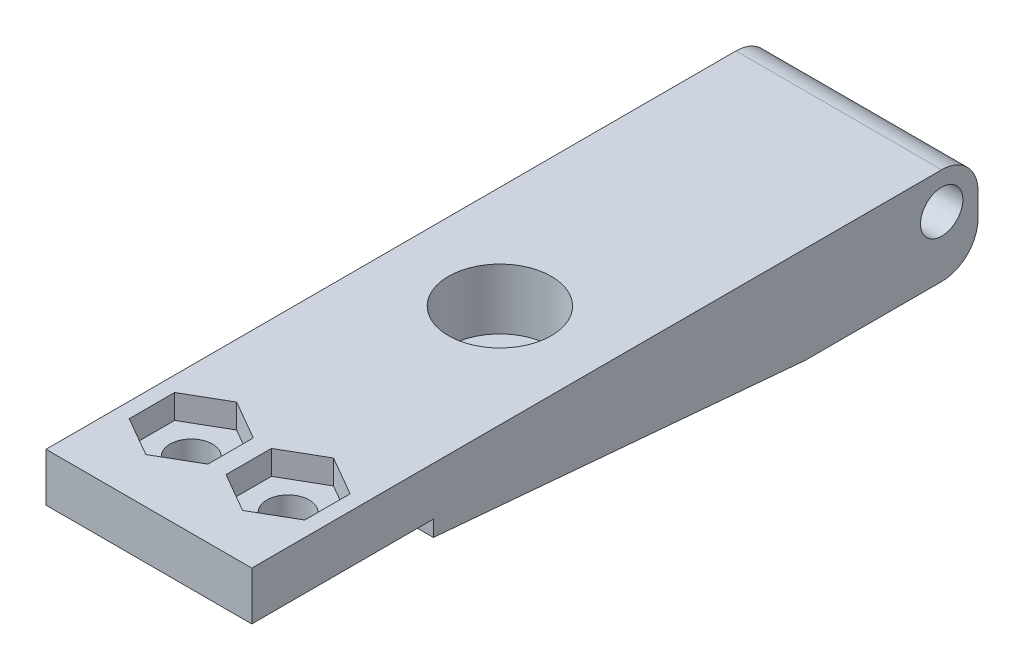
ISO-10303-21;
HEADER;
FILE_DESCRIPTION(('STEP AP214'),'2;1');
FILE_NAME('part.step','',(''),(''),'','','');
FILE_SCHEMA(('AUTOMOTIVE_DESIGN { 1 0 10303 214 1 1 1 1 }'));
ENDSEC;
DATA;
#1=APPLICATION_CONTEXT('core data for automotive mechanical design processes');
#2=APPLICATION_PROTOCOL_DEFINITION('international standard','automotive_design',2000,#1);
#3=PRODUCT_CONTEXT('',#1,'mechanical');
#4=PRODUCT('Part','Part','',(#3));
#5=PRODUCT_RELATED_PRODUCT_CATEGORY('part','',(#4));
#6=PRODUCT_DEFINITION_FORMATION('','',#4);
#7=PRODUCT_DEFINITION_CONTEXT('part definition',#1,'design');
#8=PRODUCT_DEFINITION('design','',#6,#7);
#9=PRODUCT_DEFINITION_SHAPE('','',#8);
#10=(LENGTH_UNIT() NAMED_UNIT(*) SI_UNIT(.MILLI.,.METRE.));
#11=(NAMED_UNIT(*) PLANE_ANGLE_UNIT() SI_UNIT($,.RADIAN.));
#12=(NAMED_UNIT(*) SI_UNIT($,.STERADIAN.) SOLID_ANGLE_UNIT());
#13=UNCERTAINTY_MEASURE_WITH_UNIT(LENGTH_MEASURE(1.E-05),#10,'distance_accuracy_value','');
#14=(GEOMETRIC_REPRESENTATION_CONTEXT(3) GLOBAL_UNCERTAINTY_ASSIGNED_CONTEXT((#13)) GLOBAL_UNIT_ASSIGNED_CONTEXT((#10,
#11,#12)) REPRESENTATION_CONTEXT('',''));
#15=CARTESIAN_POINT('',(0.,0.,0.));
#16=DIRECTION('',(0.,0.,1.));
#17=DIRECTION('',(1.,0.,0.));
#18=AXIS2_PLACEMENT_3D('',#15,#16,#17);
#19=CARTESIAN_POINT('',(4.,-5.,49.5));
#20=DIRECTION('',(0.,1.,0.));
#21=DIRECTION('',(0.,0.,-1.));
#22=AXIS2_PLACEMENT_3D('',#19,#20,#21);
#23=CYLINDRICAL_SURFACE('',#22,1.75);
#24=CARTESIAN_POINT('',(4.,-1.,49.5));
#25=DIRECTION('',(0.,1.,0.));
#26=DIRECTION('',(0.,0.,1.));
#27=AXIS2_PLACEMENT_3D('',#24,#25,#26);
#28=CIRCLE('',#27,1.75);
#29=CARTESIAN_POINT('',(4.,-1.,51.25));
#30=VERTEX_POINT('',#29);
#31=EDGE_CURVE('E239',#30,#30,#28,.T.);
#32=ORIENTED_EDGE('',*,*,#31,.F.);
#33=EDGE_LOOP('',(#32));
#34=FACE_BOUND('',#33,.T.);
#35=CARTESIAN_POINT('',(4.,1.,49.5));
#36=DIRECTION('',(0.,-1.,0.));
#37=DIRECTION('',(0.,0.,-1.));
#38=AXIS2_PLACEMENT_3D('',#35,#36,#37);
#39=CIRCLE('',#38,1.75);
#40=CARTESIAN_POINT('',(4.,1.,47.75));
#41=VERTEX_POINT('',#40);
#42=EDGE_CURVE('E210',#41,#41,#39,.T.);
#43=ORIENTED_EDGE('',*,*,#42,.F.);
#44=EDGE_LOOP('',(#43));
#45=FACE_BOUND('',#44,.T.);
#46=ADVANCED_FACE('F43',(#34,#45),#23,.F.);
#47=CARTESIAN_POINT('',(-4.,-5.,49.5));
#48=DIRECTION('',(0.,1.,0.));
#49=DIRECTION('',(0.,0.,-1.));
#50=AXIS2_PLACEMENT_3D('',#47,#48,#49);
#51=CYLINDRICAL_SURFACE('',#50,1.75);
#52=CARTESIAN_POINT('',(-4.,-1.,49.5));
#53=DIRECTION('',(0.,1.,0.));
#54=DIRECTION('',(0.,0.,1.));
#55=AXIS2_PLACEMENT_3D('',#52,#53,#54);
#56=CIRCLE('',#55,1.75);
#57=CARTESIAN_POINT('',(-4.,-1.,51.25));
#58=VERTEX_POINT('',#57);
#59=EDGE_CURVE('E47',#58,#58,#56,.T.);
#60=ORIENTED_EDGE('',*,*,#59,.F.);
#61=EDGE_LOOP('',(#60));
#62=FACE_BOUND('',#61,.T.);
#63=CARTESIAN_POINT('',(-4.,1.,49.5));
#64=DIRECTION('',(0.,-1.,0.));
#65=DIRECTION('',(0.,0.,-1.));
#66=AXIS2_PLACEMENT_3D('',#63,#64,#65);
#67=CIRCLE('',#66,1.75);
#68=CARTESIAN_POINT('',(-4.,1.,47.75));
#69=VERTEX_POINT('',#68);
#70=EDGE_CURVE('E247',#69,#69,#67,.T.);
#71=ORIENTED_EDGE('',*,*,#70,.F.);
#72=EDGE_LOOP('',(#71));
#73=FACE_BOUND('',#72,.T.);
#74=ADVANCED_FACE('F374',(#62,#73),#51,.F.);
#75=CARTESIAN_POINT('',(8.5,3.,0.));
#76=DIRECTION('',(0.,1.,0.));
#77=DIRECTION('',(0.,0.,-1.));
#78=AXIS2_PLACEMENT_3D('',#75,#76,#77);
#79=PLANE('',#78);
#80=CARTESIAN_POINT('',(0.,3.,28.));
#81=DIRECTION('',(0.,-1.,0.));
#82=DIRECTION('',(0.,0.,-1.));
#83=AXIS2_PLACEMENT_3D('',#80,#81,#82);
#84=CIRCLE('',#83,4.25);
#85=CARTESIAN_POINT('',(0.,3.,23.75));
#86=VERTEX_POINT('',#85);
#87=EDGE_CURVE('E615',#86,#86,#84,.T.);
#88=ORIENTED_EDGE('',*,*,#87,.T.);
#89=EDGE_LOOP('',(#88));
#90=FACE_BOUND('',#89,.T.);
#91=DIRECTION('',(-0.86602540378444,0.,-0.499999999999998));
#92=VECTOR('',#91,1.);
#93=CARTESIAN_POINT('',(-22.0591287436648,3.,38.2075317547307));
#94=LINE('',#93,#92);
#95=CARTESIAN_POINT('',(4.,3.,53.2527767497326));
#96=VERTEX_POINT('',#95);
#97=CARTESIAN_POINT('',(0.749999999999982,3.,51.3763883748663));
#98=VERTEX_POINT('',#97);
#99=EDGE_CURVE('E223',#96,#98,#94,.T.);
#100=ORIENTED_EDGE('',*,*,#99,.T.);
#101=DIRECTION('',(0.,0.,-1.));
#102=VECTOR('',#101,1.);
#103=CARTESIAN_POINT('',(0.749999999999973,3.,0.));
#104=LINE('',#103,#102);
#105=CARTESIAN_POINT('',(0.74999999999998,3.,47.6236116251337));
#106=VERTEX_POINT('',#105);
#107=EDGE_CURVE('E203',#98,#106,#104,.T.);
#108=ORIENTED_EDGE('',*,*,#107,.T.);
#109=DIRECTION('',(0.866025403784438,0.,-0.500000000000001));
#110=VECTOR('',#109,1.);
#111=CARTESIAN_POINT('',(20.8091287436649,3.,36.0424682452694));
#112=LINE('',#111,#110);
#113=CARTESIAN_POINT('',(4.,3.,45.7472232502674));
#114=VERTEX_POINT('',#113);
#115=EDGE_CURVE('E227',#106,#114,#112,.T.);
#116=ORIENTED_EDGE('',*,*,#115,.T.);
#117=DIRECTION('',(0.866025403784439,0.,0.5));
#118=VECTOR('',#117,1.);
#119=CARTESIAN_POINT('',(-18.8091287436648,3.,32.5783666301317));
#120=LINE('',#119,#118);
#121=CARTESIAN_POINT('',(7.25000000000001,3.,47.6236116251337));
#122=VERTEX_POINT('',#121);
#123=EDGE_CURVE('E230',#114,#122,#120,.T.);
#124=ORIENTED_EDGE('',*,*,#123,.T.);
#125=DIRECTION('',(0.,0.,1.));
#126=VECTOR('',#125,1.);
#127=CARTESIAN_POINT('',(7.25000000000001,3.,0.));
#128=LINE('',#127,#126);
#129=CARTESIAN_POINT('',(7.25000000000001,3.,51.3763883748663));
#130=VERTEX_POINT('',#129);
#131=EDGE_CURVE('E233',#122,#130,#128,.T.);
#132=ORIENTED_EDGE('',*,*,#131,.T.);
#133=DIRECTION('',(-0.866025403784437,0.,0.500000000000003));
#134=VECTOR('',#133,1.);
#135=CARTESIAN_POINT('',(24.059128743665,3.,41.6716333698682));
#136=LINE('',#135,#134);
#137=EDGE_CURVE('E213',#130,#96,#136,.T.);
#138=ORIENTED_EDGE('',*,*,#137,.T.);
#139=EDGE_LOOP('',(#100,#108,#116,#124,#132,#138));
#140=FACE_BOUND('',#139,.T.);
#141=DIRECTION('',(0.866025403784438,0.,0.500000000000001));
#142=VECTOR('',#141,1.);
#143=CARTESIAN_POINT('',(-20.8091287436649,3.,36.0424682452694));
#144=LINE('',#143,#142);
#145=CARTESIAN_POINT('',(-4.,3.,45.7472232502674));
#146=VERTEX_POINT('',#145);
#147=CARTESIAN_POINT('',(-0.749999999999987,3.,47.6236116251337));
#148=VERTEX_POINT('',#147);
#149=EDGE_CURVE('E263',#146,#148,#144,.T.);
#150=ORIENTED_EDGE('',*,*,#149,.T.);
#151=DIRECTION('',(0.,0.,1.));
#152=VECTOR('',#151,1.);
#153=CARTESIAN_POINT('',(-0.749999999999988,3.,0.));
#154=LINE('',#153,#152);
#155=CARTESIAN_POINT('',(-0.749999999999987,3.,51.3763883748663));
#156=VERTEX_POINT('',#155);
#157=EDGE_CURVE('E266',#148,#156,#154,.T.);
#158=ORIENTED_EDGE('',*,*,#157,.T.);
#159=DIRECTION('',(-0.866025403784441,0.,0.499999999999996));
#160=VECTOR('',#159,1.);
#161=CARTESIAN_POINT('',(22.0591287436647,3.,38.2075317547308));
#162=LINE('',#161,#160);
#163=CARTESIAN_POINT('',(-4.,3.,53.2527767497326));
#164=VERTEX_POINT('',#163);
#165=EDGE_CURVE('E270',#156,#164,#162,.T.);
#166=ORIENTED_EDGE('',*,*,#165,.T.);
#167=DIRECTION('',(-0.86602540378444,0.,-0.499999999999998));
#168=VECTOR('',#167,1.);
#169=CARTESIAN_POINT('',(-24.0591287436648,3.,41.6716333698684));
#170=LINE('',#169,#168);
#171=CARTESIAN_POINT('',(-7.25000000000001,3.,51.3763883748663));
#172=VERTEX_POINT('',#171);
#173=EDGE_CURVE('E273',#164,#172,#170,.T.);
#174=ORIENTED_EDGE('',*,*,#173,.T.);
#175=DIRECTION('',(0.,0.,-1.));
#176=VECTOR('',#175,1.);
#177=CARTESIAN_POINT('',(-7.25000000000002,3.,0.));
#178=LINE('',#177,#176);
#179=CARTESIAN_POINT('',(-7.25000000000002,3.,47.6236116251337));
#180=VERTEX_POINT('',#179);
#181=EDGE_CURVE('E276',#172,#180,#178,.T.);
#182=ORIENTED_EDGE('',*,*,#181,.T.);
#183=DIRECTION('',(0.866025403784439,0.,-0.5));
#184=VECTOR('',#183,1.);
#185=CARTESIAN_POINT('',(18.8091287436649,3.,32.5783666301317));
#186=LINE('',#185,#184);
#187=EDGE_CURVE('E251',#180,#146,#186,.T.);
#188=ORIENTED_EDGE('',*,*,#187,.T.);
#189=EDGE_LOOP('',(#150,#158,#166,#174,#182,#188));
#190=FACE_BOUND('',#189,.T.);
#191=DIRECTION('',(0.,0.,1.));
#192=VECTOR('',#191,1.);
#193=CARTESIAN_POINT('',(-8.5,3.,0.));
#194=LINE('',#193,#192);
#195=CARTESIAN_POINT('',(-8.5,3.,0.));
#196=VERTEX_POINT('',#195);
#197=CARTESIAN_POINT('',(-8.5,3.,57.));
#198=VERTEX_POINT('',#197);
#199=EDGE_CURVE('E320',#196,#198,#194,.T.);
#200=ORIENTED_EDGE('',*,*,#199,.T.);
#201=DIRECTION('',(-1.,0.,0.));
#202=VECTOR('',#201,1.);
#203=CARTESIAN_POINT('',(8.5,3.,57.));
#204=LINE('',#203,#202);
#205=CARTESIAN_POINT('',(8.5,3.,57.));
#206=VERTEX_POINT('',#205);
#207=EDGE_CURVE('E316',#206,#198,#204,.T.);
#208=ORIENTED_EDGE('',*,*,#207,.F.);
#209=DIRECTION('',(0.,0.,1.));
#210=VECTOR('',#209,1.);
#211=CARTESIAN_POINT('',(8.5,3.,0.));
#212=LINE('',#211,#210);
#213=CARTESIAN_POINT('',(8.5,3.,0.));
#214=VERTEX_POINT('',#213);
#215=EDGE_CURVE('E294',#214,#206,#212,.T.);
#216=ORIENTED_EDGE('',*,*,#215,.F.);
#217=DIRECTION('',(-1.,0.,0.));
#218=VECTOR('',#217,1.);
#219=CARTESIAN_POINT('',(8.5,3.,0.));
#220=LINE('',#219,#218);
#221=EDGE_CURVE('E357',#214,#196,#220,.T.);
#222=ORIENTED_EDGE('',*,*,#221,.T.);
#223=EDGE_LOOP('',(#200,#208,#216,#222));
#224=FACE_BOUND('',#223,.T.);
#225=ADVANCED_FACE('F377',(#90,#140,#190,#224),#79,.T.);
#226=CARTESIAN_POINT('',(8.5,0.,0.));
#227=DIRECTION('',(-1.,0.,0.));
#228=DIRECTION('',(0.,0.,-1.));
#229=AXIS2_PLACEMENT_3D('',#226,#227,#228);
#230=CYLINDRICAL_SURFACE('',#229,3.);
#231=CARTESIAN_POINT('',(-8.5,0.,0.));
#232=DIRECTION('',(-1.,0.,0.));
#233=DIRECTION('',(0.,0.,1.));
#234=AXIS2_PLACEMENT_3D('',#231,#232,#233);
#235=CIRCLE('',#234,3.);
#236=CARTESIAN_POINT('',(-8.5,0.,-3.));
#237=VERTEX_POINT('',#236);
#238=EDGE_CURVE('E323',#196,#237,#235,.T.);
#239=ORIENTED_EDGE('',*,*,#238,.F.);
#240=ORIENTED_EDGE('',*,*,#221,.F.);
#241=CARTESIAN_POINT('',(8.5,0.,0.));
#242=DIRECTION('',(-1.,0.,0.));
#243=DIRECTION('',(0.,0.,1.));
#244=AXIS2_PLACEMENT_3D('',#241,#242,#243);
#245=CIRCLE('',#244,3.);
#246=CARTESIAN_POINT('',(8.5,0.,-3.));
#247=VERTEX_POINT('',#246);
#248=EDGE_CURVE('E298',#214,#247,#245,.T.);
#249=ORIENTED_EDGE('',*,*,#248,.T.);
#250=DIRECTION('',(-1.,0.,0.));
#251=VECTOR('',#250,1.);
#252=CARTESIAN_POINT('',(8.5,0.,-3.));
#253=LINE('',#252,#251);
#254=EDGE_CURVE('E354',#247,#237,#253,.T.);
#255=ORIENTED_EDGE('',*,*,#254,.T.);
#256=EDGE_LOOP('',(#239,#240,#249,#255));
#257=FACE_BOUND('',#256,.T.);
#258=ADVANCED_FACE('F456',(#257),#230,.T.);
#259=CARTESIAN_POINT('',(8.5,0.,-3.));
#260=DIRECTION('',(0.,0.,1.));
#261=DIRECTION('',(0.,1.,0.));
#262=AXIS2_PLACEMENT_3D('',#259,#260,#261);
#263=PLANE('',#262);
#264=DIRECTION('',(0.,-1.,0.));
#265=VECTOR('',#264,1.);
#266=CARTESIAN_POINT('',(-8.5,0.,-3.));
#267=LINE('',#266,#265);
#268=CARTESIAN_POINT('',(-8.5,-2.,-3.));
#269=VERTEX_POINT('',#268);
#270=EDGE_CURVE('E326',#237,#269,#267,.T.);
#271=ORIENTED_EDGE('',*,*,#270,.F.);
#272=ORIENTED_EDGE('',*,*,#254,.F.);
#273=DIRECTION('',(0.,-1.,0.));
#274=VECTOR('',#273,1.);
#275=CARTESIAN_POINT('',(8.5,0.,-3.));
#276=LINE('',#275,#274);
#277=CARTESIAN_POINT('',(8.5,-2.,-3.));
#278=VERTEX_POINT('',#277);
#279=EDGE_CURVE('E301',#247,#278,#276,.T.);
#280=ORIENTED_EDGE('',*,*,#279,.T.);
#281=DIRECTION('',(-1.,0.,0.));
#282=VECTOR('',#281,1.);
#283=CARTESIAN_POINT('',(8.5,-2.,-3.));
#284=LINE('',#283,#282);
#285=EDGE_CURVE('E52',#269,#278,#284,.F.);
#286=ORIENTED_EDGE('',*,*,#285,.F.);
#287=EDGE_LOOP('',(#271,#272,#280,#286));
#288=FACE_BOUND('',#287,.T.);
#289=ADVANCED_FACE('F452',(#288),#263,.F.);
#290=CARTESIAN_POINT('',(8.5,-5.,0.));
#291=DIRECTION('',(0.,1.,0.));
#292=DIRECTION('',(0.,0.,-1.));
#293=AXIS2_PLACEMENT_3D('',#290,#291,#292);
#294=PLANE('',#293);
#295=DIRECTION('',(0.,0.,1.));
#296=VECTOR('',#295,1.);
#297=CARTESIAN_POINT('',(8.5,-5.,0.));
#298=LINE('',#297,#296);
#299=CARTESIAN_POINT('',(8.5,-5.,0.));
#300=VERTEX_POINT('',#299);
#301=CARTESIAN_POINT('',(8.5,-5.,11.2797907889547));
#302=VERTEX_POINT('',#301);
#303=EDGE_CURVE('E304',#300,#302,#298,.T.);
#304=ORIENTED_EDGE('',*,*,#303,.T.);
#305=DIRECTION('',(-1.,0.,0.));
#306=VECTOR('',#305,1.);
#307=CARTESIAN_POINT('',(8.5,-5.,11.2797907889547));
#308=LINE('',#307,#306);
#309=CARTESIAN_POINT('',(-8.5,-5.,11.2797907889547));
#310=VERTEX_POINT('',#309);
#311=EDGE_CURVE('E351',#302,#310,#308,.T.);
#312=ORIENTED_EDGE('',*,*,#311,.T.);
#313=DIRECTION('',(0.,0.,1.));
#314=VECTOR('',#313,1.);
#315=CARTESIAN_POINT('',(-8.5,-5.,0.));
#316=LINE('',#315,#314);
#317=CARTESIAN_POINT('',(-8.5,-5.,0.));
#318=VERTEX_POINT('',#317);
#319=EDGE_CURVE('E329',#318,#310,#316,.T.);
#320=ORIENTED_EDGE('',*,*,#319,.F.);
#321=DIRECTION('',(-1.,0.,0.));
#322=VECTOR('',#321,1.);
#323=CARTESIAN_POINT('',(8.5,-5.,0.));
#324=LINE('',#323,#322);
#325=EDGE_CURVE('E360',#300,#318,#324,.T.);
#326=ORIENTED_EDGE('',*,*,#325,.F.);
#327=EDGE_LOOP('',(#304,#312,#320,#326));
#328=FACE_BOUND('',#327,.T.);
#329=ADVANCED_FACE('F448',(#328),#294,.F.);
#330=CARTESIAN_POINT('',(8.5,-5.94137694001363,0.519803127985537));
#331=DIRECTION('',(0.,0.996194698091746,-0.0871557427476583));
#332=DIRECTION('',(0.,-0.0871557427476583,-0.996194698091746));
#333=AXIS2_PLACEMENT_3D('',#330,#331,#332);
#334=PLANE('',#333);
#335=DIRECTION('',(0.,0.0871557427476583,0.996194698091746));
#336=VECTOR('',#335,1.);
#337=CARTESIAN_POINT('',(-8.5,-5.94137694001363,0.519803127985537));
#338=LINE('',#337,#336);
#339=CARTESIAN_POINT('',(-8.5,-2.31232995288886,42.));
#340=VERTEX_POINT('',#339);
#341=EDGE_CURVE('E332',#310,#340,#338,.T.);
#342=ORIENTED_EDGE('',*,*,#341,.F.);
#343=ORIENTED_EDGE('',*,*,#311,.F.);
#344=DIRECTION('',(0.,0.0871557427476583,0.996194698091746));
#345=VECTOR('',#344,1.);
#346=CARTESIAN_POINT('',(8.5,-5.94137694001363,0.519803127985537));
#347=LINE('',#346,#345);
#348=CARTESIAN_POINT('',(8.5,-2.31232995288886,42.));
#349=VERTEX_POINT('',#348);
#350=EDGE_CURVE('E307',#302,#349,#347,.T.);
#351=ORIENTED_EDGE('',*,*,#350,.T.);
#352=DIRECTION('',(-1.,0.,0.));
#353=VECTOR('',#352,1.);
#354=CARTESIAN_POINT('',(8.5,-2.31232995288886,42.));
#355=LINE('',#354,#353);
#356=EDGE_CURVE('E348',#349,#340,#355,.T.);
#357=ORIENTED_EDGE('',*,*,#356,.T.);
#358=EDGE_LOOP('',(#342,#343,#351,#357));
#359=FACE_BOUND('',#358,.T.);
#360=ADVANCED_FACE('F444',(#359),#334,.F.);
#361=CARTESIAN_POINT('',(8.5,0.,42.));
#362=DIRECTION('',(0.,0.,1.));
#363=DIRECTION('',(-1.,0.,0.));
#364=AXIS2_PLACEMENT_3D('',#361,#362,#363);
#365=PLANE('',#364);
#366=DIRECTION('',(0.,-1.,0.));
#367=VECTOR('',#366,1.);
#368=CARTESIAN_POINT('',(-8.5,0.,42.));
#369=LINE('',#368,#367);
#370=CARTESIAN_POINT('',(-8.5,-1.,42.));
#371=VERTEX_POINT('',#370);
#372=EDGE_CURVE('E335',#371,#340,#369,.T.);
#373=ORIENTED_EDGE('',*,*,#372,.T.);
#374=ORIENTED_EDGE('',*,*,#356,.F.);
#375=DIRECTION('',(0.,-1.,0.));
#376=VECTOR('',#375,1.);
#377=CARTESIAN_POINT('',(8.5,0.,42.));
#378=LINE('',#377,#376);
#379=CARTESIAN_POINT('',(8.5,-1.,42.));
#380=VERTEX_POINT('',#379);
#381=EDGE_CURVE('E310',#380,#349,#378,.T.);
#382=ORIENTED_EDGE('',*,*,#381,.F.);
#383=DIRECTION('',(-1.,0.,0.));
#384=VECTOR('',#383,1.);
#385=CARTESIAN_POINT('',(8.5,-1.,42.));
#386=LINE('',#385,#384);
#387=EDGE_CURVE('E345',#380,#371,#386,.T.);
#388=ORIENTED_EDGE('',*,*,#387,.T.);
#389=EDGE_LOOP('',(#373,#374,#382,#388));
#390=FACE_BOUND('',#389,.T.);
#391=ADVANCED_FACE('F441',(#390),#365,.T.);
#392=CARTESIAN_POINT('',(8.5,-1.00000000000001,0.));
#393=DIRECTION('',(0.,-1.,0.));
#394=DIRECTION('',(0.,0.,1.));
#395=AXIS2_PLACEMENT_3D('',#392,#393,#394);
#396=PLANE('',#395);
#397=ORIENTED_EDGE('',*,*,#59,.T.);
#398=EDGE_LOOP('',(#397));
#399=FACE_BOUND('',#398,.T.);
#400=ORIENTED_EDGE('',*,*,#31,.T.);
#401=EDGE_LOOP('',(#400));
#402=FACE_BOUND('',#401,.T.);
#403=DIRECTION('',(0.,0.,-1.));
#404=VECTOR('',#403,1.);
#405=CARTESIAN_POINT('',(-8.5,-1.00000000000001,0.));
#406=LINE('',#405,#404);
#407=CARTESIAN_POINT('',(-8.5,-1.,57.));
#408=VERTEX_POINT('',#407);
#409=EDGE_CURVE('E337',#408,#371,#406,.T.);
#410=ORIENTED_EDGE('',*,*,#409,.T.);
#411=ORIENTED_EDGE('',*,*,#387,.F.);
#412=DIRECTION('',(0.,0.,-1.));
#413=VECTOR('',#412,1.);
#414=CARTESIAN_POINT('',(8.5,-1.00000000000001,0.));
#415=LINE('',#414,#413);
#416=CARTESIAN_POINT('',(8.5,-1.,57.));
#417=VERTEX_POINT('',#416);
#418=EDGE_CURVE('E312',#417,#380,#415,.T.);
#419=ORIENTED_EDGE('',*,*,#418,.F.);
#420=DIRECTION('',(-1.,0.,0.));
#421=VECTOR('',#420,1.);
#422=CARTESIAN_POINT('',(8.5,-1.,57.));
#423=LINE('',#422,#421);
#424=EDGE_CURVE('E342',#417,#408,#423,.T.);
#425=ORIENTED_EDGE('',*,*,#424,.T.);
#426=EDGE_LOOP('',(#410,#411,#419,#425));
#427=FACE_BOUND('',#426,.T.);
#428=ADVANCED_FACE('F372',(#399,#402,#427),#396,.T.);
#429=CARTESIAN_POINT('',(8.5,0.,0.));
#430=DIRECTION('',(-1.,0.,0.));
#431=DIRECTION('',(0.,0.,-1.));
#432=AXIS2_PLACEMENT_3D('',#429,#430,#431);
#433=CYLINDRICAL_SURFACE('',#432,1.75);
#434=CARTESIAN_POINT('',(8.5,0.,0.));
#435=DIRECTION('',(-1.,0.,0.));
#436=DIRECTION('',(0.,0.,1.));
#437=AXIS2_PLACEMENT_3D('',#434,#435,#436);
#438=CIRCLE('',#437,1.75);
#439=CARTESIAN_POINT('',(8.5,0.,1.75));
#440=VERTEX_POINT('',#439);
#441=EDGE_CURVE('E291',#440,#440,#438,.T.);
#442=ORIENTED_EDGE('',*,*,#441,.F.);
#443=EDGE_LOOP('',(#442));
#444=FACE_BOUND('',#443,.T.);
#445=CARTESIAN_POINT('',(-8.5,0.,0.));
#446=DIRECTION('',(-1.,0.,0.));
#447=DIRECTION('',(0.,0.,1.));
#448=AXIS2_PLACEMENT_3D('',#445,#446,#447);
#449=CIRCLE('',#448,1.75);
#450=CARTESIAN_POINT('',(-8.5,0.,1.75));
#451=VERTEX_POINT('',#450);
#452=EDGE_CURVE('E317',#451,#451,#449,.T.);
#453=ORIENTED_EDGE('',*,*,#452,.T.);
#454=EDGE_LOOP('',(#453));
#455=FACE_BOUND('',#454,.T.);
#456=ADVANCED_FACE('F437',(#444,#455),#433,.F.);
#457=CARTESIAN_POINT('',(8.5,0.,57.));
#458=DIRECTION('',(0.,0.,1.));
#459=DIRECTION('',(-1.,0.,0.));
#460=AXIS2_PLACEMENT_3D('',#457,#458,#459);
#461=PLANE('',#460);
#462=DIRECTION('',(0.,-1.,0.));
#463=VECTOR('',#462,1.);
#464=CARTESIAN_POINT('',(-8.5,0.,57.));
#465=LINE('',#464,#463);
#466=EDGE_CURVE('E295',#198,#408,#465,.T.);
#467=ORIENTED_EDGE('',*,*,#466,.T.);
#468=ORIENTED_EDGE('',*,*,#424,.F.);
#469=DIRECTION('',(0.,-1.,0.));
#470=VECTOR('',#469,1.);
#471=CARTESIAN_POINT('',(8.5,0.,57.));
#472=LINE('',#471,#470);
#473=EDGE_CURVE('E314',#206,#417,#472,.T.);
#474=ORIENTED_EDGE('',*,*,#473,.F.);
#475=ORIENTED_EDGE('',*,*,#207,.T.);
#476=EDGE_LOOP('',(#467,#468,#474,#475));
#477=FACE_BOUND('',#476,.T.);
#478=ADVANCED_FACE('F430',(#477),#461,.T.);
#479=CARTESIAN_POINT('',(8.5,0.,0.));
#480=DIRECTION('',(1.,0.,0.));
#481=DIRECTION('',(0.,0.,1.));
#482=AXIS2_PLACEMENT_3D('',#479,#480,#481);
#483=PLANE('',#482);
#484=ORIENTED_EDGE('',*,*,#441,.T.);
#485=EDGE_LOOP('',(#484));
#486=FACE_BOUND('',#485,.T.);
#487=ORIENTED_EDGE('',*,*,#279,.F.);
#488=ORIENTED_EDGE('',*,*,#248,.F.);
#489=ORIENTED_EDGE('',*,*,#215,.T.);
#490=ORIENTED_EDGE('',*,*,#473,.T.);
#491=ORIENTED_EDGE('',*,*,#418,.T.);
#492=ORIENTED_EDGE('',*,*,#381,.T.);
#493=ORIENTED_EDGE('',*,*,#350,.F.);
#494=ORIENTED_EDGE('',*,*,#303,.F.);
#495=CARTESIAN_POINT('',(8.5,-2.,0.));
#496=DIRECTION('',(-1.,0.,0.));
#497=DIRECTION('',(0.,0.,1.));
#498=AXIS2_PLACEMENT_3D('',#495,#496,#497);
#499=CIRCLE('',#498,3.);
#500=EDGE_CURVE('E11',#278,#300,#499,.T.);
#501=ORIENTED_EDGE('',*,*,#500,.F.);
#502=EDGE_LOOP('',(#487,#488,#489,#490,#491,#492,#493,#494,#501));
#503=FACE_BOUND('',#502,.T.);
#504=ADVANCED_FACE('F426',(#486,#503),#483,.T.);
#505=CARTESIAN_POINT('',(-8.5,0.,0.));
#506=DIRECTION('',(1.,0.,0.));
#507=DIRECTION('',(0.,0.,1.));
#508=AXIS2_PLACEMENT_3D('',#505,#506,#507);
#509=PLANE('',#508);
#510=ORIENTED_EDGE('',*,*,#452,.F.);
#511=EDGE_LOOP('',(#510));
#512=FACE_BOUND('',#511,.T.);
#513=ORIENTED_EDGE('',*,*,#319,.T.);
#514=ORIENTED_EDGE('',*,*,#341,.T.);
#515=ORIENTED_EDGE('',*,*,#372,.F.);
#516=ORIENTED_EDGE('',*,*,#409,.F.);
#517=ORIENTED_EDGE('',*,*,#466,.F.);
#518=ORIENTED_EDGE('',*,*,#199,.F.);
#519=ORIENTED_EDGE('',*,*,#238,.T.);
#520=ORIENTED_EDGE('',*,*,#270,.T.);
#521=CARTESIAN_POINT('',(-8.5,-2.,0.));
#522=DIRECTION('',(-1.,0.,0.));
#523=DIRECTION('',(0.,0.,1.));
#524=AXIS2_PLACEMENT_3D('',#521,#522,#523);
#525=CIRCLE('',#524,3.);
#526=EDGE_CURVE('E363',#318,#269,#525,.F.);
#527=ORIENTED_EDGE('',*,*,#526,.F.);
#528=EDGE_LOOP('',(#513,#514,#515,#516,#517,#518,#519,#520,#527));
#529=FACE_BOUND('',#528,.T.);
#530=ADVANCED_FACE('F429',(#512,#529),#509,.F.);
#531=CARTESIAN_POINT('',(8.5,-2.,0.));
#532=DIRECTION('',(-1.,0.,0.));
#533=DIRECTION('',(0.,0.,-1.));
#534=AXIS2_PLACEMENT_3D('',#531,#532,#533);
#535=CYLINDRICAL_SURFACE('',#534,3.);
#536=ORIENTED_EDGE('',*,*,#500,.T.);
#537=ORIENTED_EDGE('',*,*,#325,.T.);
#538=ORIENTED_EDGE('',*,*,#526,.T.);
#539=ORIENTED_EDGE('',*,*,#285,.T.);
#540=EDGE_LOOP('',(#536,#537,#538,#539));
#541=FACE_BOUND('',#540,.T.);
#542=ADVANCED_FACE('F45',(#541),#535,.T.);
#543=CARTESIAN_POINT('',(-20.8091287436649,1.,36.0424682452694));
#544=DIRECTION('',(0.500000000000001,0.,-0.866025403784438));
#545=DIRECTION('',(0.866025403784438,0.,0.500000000000001));
#546=AXIS2_PLACEMENT_3D('',#543,#544,#545);
#547=PLANE('',#546);
#548=ORIENTED_EDGE('',*,*,#149,.F.);
#549=DIRECTION('',(0.,1.,0.));
#550=VECTOR('',#549,1.);
#551=CARTESIAN_POINT('',(-4.,1.,45.7472232502674));
#552=LINE('',#551,#550);
#553=CARTESIAN_POINT('',(-4.,1.,45.7472232502674));
#554=VERTEX_POINT('',#553);
#555=EDGE_CURVE('E225',#554,#146,#552,.T.);
#556=ORIENTED_EDGE('',*,*,#555,.F.);
#557=DIRECTION('',(0.866025403784438,0.,0.500000000000001));
#558=VECTOR('',#557,1.);
#559=CARTESIAN_POINT('',(-20.8091287436649,1.,36.0424682452694));
#560=LINE('',#559,#558);
#561=CARTESIAN_POINT('',(-0.749999999999987,1.,47.6236116251337));
#562=VERTEX_POINT('',#561);
#563=EDGE_CURVE('E250',#554,#562,#560,.T.);
#564=ORIENTED_EDGE('',*,*,#563,.T.);
#565=DIRECTION('',(0.,1.,0.));
#566=VECTOR('',#565,1.);
#567=CARTESIAN_POINT('',(-0.749999999999987,1.,47.6236116251337));
#568=LINE('',#567,#566);
#569=EDGE_CURVE('E68',#562,#148,#568,.T.);
#570=ORIENTED_EDGE('',*,*,#569,.T.);
#571=EDGE_LOOP('',(#548,#556,#564,#570));
#572=FACE_BOUND('',#571,.T.);
#573=ADVANCED_FACE('F392',(#572),#547,.F.);
#574=CARTESIAN_POINT('',(18.8091287436649,1.,32.5783666301317));
#575=DIRECTION('',(-0.5,0.,-0.866025403784439));
#576=DIRECTION('',(0.866025403784439,0.,-0.5));
#577=AXIS2_PLACEMENT_3D('',#574,#575,#576);
#578=PLANE('',#577);
#579=ORIENTED_EDGE('',*,*,#187,.F.);
#580=DIRECTION('',(0.,1.,0.));
#581=VECTOR('',#580,1.);
#582=CARTESIAN_POINT('',(-7.25000000000002,1.,47.6236116251337));
#583=LINE('',#582,#581);
#584=CARTESIAN_POINT('',(-7.25000000000002,1.,47.6236116251337));
#585=VERTEX_POINT('',#584);
#586=EDGE_CURVE('E282',#585,#180,#583,.T.);
#587=ORIENTED_EDGE('',*,*,#586,.F.);
#588=DIRECTION('',(0.866025403784439,0.,-0.5));
#589=VECTOR('',#588,1.);
#590=CARTESIAN_POINT('',(18.8091287436649,1.,32.5783666301317));
#591=LINE('',#590,#589);
#592=EDGE_CURVE('E261',#585,#554,#591,.T.);
#593=ORIENTED_EDGE('',*,*,#592,.T.);
#594=ORIENTED_EDGE('',*,*,#555,.T.);
#595=EDGE_LOOP('',(#579,#587,#593,#594));
#596=FACE_BOUND('',#595,.T.);
#597=ADVANCED_FACE('F395',(#596),#578,.F.);
#598=CARTESIAN_POINT('',(-7.25000000000002,1.,0.));
#599=DIRECTION('',(-1.,0.,0.));
#600=DIRECTION('',(0.,0.,-1.));
#601=AXIS2_PLACEMENT_3D('',#598,#599,#600);
#602=PLANE('',#601);
#603=ORIENTED_EDGE('',*,*,#181,.F.);
#604=DIRECTION('',(0.,1.,0.));
#605=VECTOR('',#604,1.);
#606=CARTESIAN_POINT('',(-7.25000000000001,1.,51.3763883748663));
#607=LINE('',#606,#605);
#608=CARTESIAN_POINT('',(-7.25000000000001,1.,51.3763883748663));
#609=VERTEX_POINT('',#608);
#610=EDGE_CURVE('E284',#609,#172,#607,.T.);
#611=ORIENTED_EDGE('',*,*,#610,.F.);
#612=DIRECTION('',(0.,0.,-1.));
#613=VECTOR('',#612,1.);
#614=CARTESIAN_POINT('',(-7.25000000000002,1.,0.));
#615=LINE('',#614,#613);
#616=EDGE_CURVE('E259',#609,#585,#615,.T.);
#617=ORIENTED_EDGE('',*,*,#616,.T.);
#618=ORIENTED_EDGE('',*,*,#586,.T.);
#619=EDGE_LOOP('',(#603,#611,#617,#618));
#620=FACE_BOUND('',#619,.T.);
#621=ADVANCED_FACE('F402',(#620),#602,.F.);
#622=CARTESIAN_POINT('',(-24.0591287436648,1.,41.6716333698684));
#623=DIRECTION('',(-0.499999999999998,0.,0.86602540378444));
#624=DIRECTION('',(-0.86602540378444,0.,-0.499999999999998));
#625=AXIS2_PLACEMENT_3D('',#622,#623,#624);
#626=PLANE('',#625);
#627=ORIENTED_EDGE('',*,*,#173,.F.);
#628=DIRECTION('',(0.,1.,0.));
#629=VECTOR('',#628,1.);
#630=CARTESIAN_POINT('',(-4.,1.,53.2527767497326));
#631=LINE('',#630,#629);
#632=CARTESIAN_POINT('',(-4.,1.,53.2527767497326));
#633=VERTEX_POINT('',#632);
#634=EDGE_CURVE('E286',#633,#164,#631,.T.);
#635=ORIENTED_EDGE('',*,*,#634,.F.);
#636=DIRECTION('',(-0.86602540378444,0.,-0.499999999999998));
#637=VECTOR('',#636,1.);
#638=CARTESIAN_POINT('',(-24.0591287436648,1.,41.6716333698684));
#639=LINE('',#638,#637);
#640=EDGE_CURVE('E257',#633,#609,#639,.T.);
#641=ORIENTED_EDGE('',*,*,#640,.T.);
#642=ORIENTED_EDGE('',*,*,#610,.T.);
#643=EDGE_LOOP('',(#627,#635,#641,#642));
#644=FACE_BOUND('',#643,.T.);
#645=ADVANCED_FACE('F407',(#644),#626,.F.);
#646=CARTESIAN_POINT('',(22.0591287436647,1.,38.2075317547308));
#647=DIRECTION('',(0.499999999999996,0.,0.866025403784441));
#648=DIRECTION('',(-0.866025403784441,0.,0.499999999999996));
#649=AXIS2_PLACEMENT_3D('',#646,#647,#648);
#650=PLANE('',#649);
#651=ORIENTED_EDGE('',*,*,#165,.F.);
#652=DIRECTION('',(0.,1.,0.));
#653=VECTOR('',#652,1.);
#654=CARTESIAN_POINT('',(-0.749999999999987,1.,51.3763883748663));
#655=LINE('',#654,#653);
#656=CARTESIAN_POINT('',(-0.749999999999987,1.,51.3763883748663));
#657=VERTEX_POINT('',#656);
#658=EDGE_CURVE('E288',#657,#156,#655,.T.);
#659=ORIENTED_EDGE('',*,*,#658,.F.);
#660=DIRECTION('',(-0.866025403784441,0.,0.499999999999996));
#661=VECTOR('',#660,1.);
#662=CARTESIAN_POINT('',(22.0591287436647,1.,38.2075317547308));
#663=LINE('',#662,#661);
#664=EDGE_CURVE('E255',#657,#633,#663,.T.);
#665=ORIENTED_EDGE('',*,*,#664,.T.);
#666=ORIENTED_EDGE('',*,*,#634,.T.);
#667=EDGE_LOOP('',(#651,#659,#665,#666));
#668=FACE_BOUND('',#667,.T.);
#669=ADVANCED_FACE('F410',(#668),#650,.F.);
#670=CARTESIAN_POINT('',(-0.749999999999988,1.,0.));
#671=DIRECTION('',(1.,0.,0.));
#672=DIRECTION('',(0.,0.,1.));
#673=AXIS2_PLACEMENT_3D('',#670,#671,#672);
#674=PLANE('',#673);
#675=ORIENTED_EDGE('',*,*,#157,.F.);
#676=ORIENTED_EDGE('',*,*,#569,.F.);
#677=DIRECTION('',(0.,0.,1.));
#678=VECTOR('',#677,1.);
#679=CARTESIAN_POINT('',(-0.749999999999988,1.,0.));
#680=LINE('',#679,#678);
#681=EDGE_CURVE('E253',#562,#657,#680,.T.);
#682=ORIENTED_EDGE('',*,*,#681,.T.);
#683=ORIENTED_EDGE('',*,*,#658,.T.);
#684=EDGE_LOOP('',(#675,#676,#682,#683));
#685=FACE_BOUND('',#684,.T.);
#686=ADVANCED_FACE('F384',(#685),#674,.F.);
#687=CARTESIAN_POINT('',(0.,1.,0.));
#688=DIRECTION('',(0.,1.,0.));
#689=DIRECTION('',(0.,0.,-1.));
#690=AXIS2_PLACEMENT_3D('',#687,#688,#689);
#691=PLANE('',#690);
#692=ORIENTED_EDGE('',*,*,#70,.T.);
#693=EDGE_LOOP('',(#692));
#694=FACE_BOUND('',#693,.T.);
#695=ORIENTED_EDGE('',*,*,#563,.F.);
#696=ORIENTED_EDGE('',*,*,#592,.F.);
#697=ORIENTED_EDGE('',*,*,#616,.F.);
#698=ORIENTED_EDGE('',*,*,#640,.F.);
#699=ORIENTED_EDGE('',*,*,#664,.F.);
#700=ORIENTED_EDGE('',*,*,#681,.F.);
#701=EDGE_LOOP('',(#695,#696,#697,#698,#699,#700));
#702=FACE_BOUND('',#701,.T.);
#703=ADVANCED_FACE('F381',(#694,#702),#691,.T.);
#704=CARTESIAN_POINT('',(-22.0591287436648,1.,38.2075317547307));
#705=DIRECTION('',(-0.499999999999998,0.,0.86602540378444));
#706=DIRECTION('',(-0.86602540378444,0.,-0.499999999999998));
#707=AXIS2_PLACEMENT_3D('',#704,#705,#706);
#708=PLANE('',#707);
#709=ORIENTED_EDGE('',*,*,#99,.F.);
#710=DIRECTION('',(0.,1.,0.));
#711=VECTOR('',#710,1.);
#712=CARTESIAN_POINT('',(4.,1.,53.2527767497326));
#713=LINE('',#712,#711);
#714=CARTESIAN_POINT('',(4.,1.,53.2527767497326));
#715=VERTEX_POINT('',#714);
#716=EDGE_CURVE('E209',#715,#96,#713,.T.);
#717=ORIENTED_EDGE('',*,*,#716,.F.);
#718=DIRECTION('',(-0.86602540378444,0.,-0.499999999999998));
#719=VECTOR('',#718,1.);
#720=CARTESIAN_POINT('',(-22.0591287436648,1.,38.2075317547307));
#721=LINE('',#720,#719);
#722=CARTESIAN_POINT('',(0.749999999999983,1.,51.3763883748663));
#723=VERTEX_POINT('',#722);
#724=EDGE_CURVE('E194',#715,#723,#721,.T.);
#725=ORIENTED_EDGE('',*,*,#724,.T.);
#726=DIRECTION('',(0.,1.,0.));
#727=VECTOR('',#726,1.);
#728=CARTESIAN_POINT('',(0.749999999999983,1.,51.3763883748663));
#729=LINE('',#728,#727);
#730=EDGE_CURVE('E60',#723,#98,#729,.T.);
#731=ORIENTED_EDGE('',*,*,#730,.T.);
#732=EDGE_LOOP('',(#709,#717,#725,#731));
#733=FACE_BOUND('',#732,.T.);
#734=ADVANCED_FACE('F208',(#733),#708,.F.);
#735=CARTESIAN_POINT('',(24.059128743665,1.,41.6716333698682));
#736=DIRECTION('',(0.500000000000003,0.,0.866025403784437));
#737=DIRECTION('',(-0.866025403784437,0.,0.500000000000003));
#738=AXIS2_PLACEMENT_3D('',#735,#736,#737);
#739=PLANE('',#738);
#740=ORIENTED_EDGE('',*,*,#137,.F.);
#741=DIRECTION('',(0.,1.,0.));
#742=VECTOR('',#741,1.);
#743=CARTESIAN_POINT('',(7.25000000000001,1.,51.3763883748663));
#744=LINE('',#743,#742);
#745=CARTESIAN_POINT('',(7.25000000000001,1.,51.3763883748663));
#746=VERTEX_POINT('',#745);
#747=EDGE_CURVE('E240',#746,#130,#744,.T.);
#748=ORIENTED_EDGE('',*,*,#747,.F.);
#749=DIRECTION('',(-0.866025403784437,0.,0.500000000000003));
#750=VECTOR('',#749,1.);
#751=CARTESIAN_POINT('',(24.059128743665,1.,41.6716333698682));
#752=LINE('',#751,#750);
#753=EDGE_CURVE('E206',#746,#715,#752,.T.);
#754=ORIENTED_EDGE('',*,*,#753,.T.);
#755=ORIENTED_EDGE('',*,*,#716,.T.);
#756=EDGE_LOOP('',(#740,#748,#754,#755));
#757=FACE_BOUND('',#756,.T.);
#758=ADVANCED_FACE('F535',(#757),#739,.F.);
#759=CARTESIAN_POINT('',(7.25000000000001,1.,0.));
#760=DIRECTION('',(1.,0.,0.));
#761=DIRECTION('',(0.,0.,1.));
#762=AXIS2_PLACEMENT_3D('',#759,#760,#761);
#763=PLANE('',#762);
#764=ORIENTED_EDGE('',*,*,#131,.F.);
#765=DIRECTION('',(0.,1.,0.));
#766=VECTOR('',#765,1.);
#767=CARTESIAN_POINT('',(7.25000000000001,1.,47.6236116251337));
#768=LINE('',#767,#766);
#769=CARTESIAN_POINT('',(7.25000000000001,1.,47.6236116251337));
#770=VERTEX_POINT('',#769);
#771=EDGE_CURVE('E242',#770,#122,#768,.T.);
#772=ORIENTED_EDGE('',*,*,#771,.F.);
#773=DIRECTION('',(0.,0.,1.));
#774=VECTOR('',#773,1.);
#775=CARTESIAN_POINT('',(7.25000000000001,1.,0.));
#776=LINE('',#775,#774);
#777=EDGE_CURVE('E220',#770,#746,#776,.T.);
#778=ORIENTED_EDGE('',*,*,#777,.T.);
#779=ORIENTED_EDGE('',*,*,#747,.T.);
#780=EDGE_LOOP('',(#764,#772,#778,#779));
#781=FACE_BOUND('',#780,.T.);
#782=ADVANCED_FACE('F543',(#781),#763,.F.);
#783=CARTESIAN_POINT('',(-18.8091287436648,1.,32.5783666301317));
#784=DIRECTION('',(0.5,0.,-0.866025403784439));
#785=DIRECTION('',(0.866025403784439,0.,0.5));
#786=AXIS2_PLACEMENT_3D('',#783,#784,#785);
#787=PLANE('',#786);
#788=ORIENTED_EDGE('',*,*,#123,.F.);
#789=DIRECTION('',(0.,1.,0.));
#790=VECTOR('',#789,1.);
#791=CARTESIAN_POINT('',(4.,1.,45.7472232502674));
#792=LINE('',#791,#790);
#793=CARTESIAN_POINT('',(4.,1.,45.7472232502674));
#794=VERTEX_POINT('',#793);
#795=EDGE_CURVE('E244',#794,#114,#792,.T.);
#796=ORIENTED_EDGE('',*,*,#795,.F.);
#797=DIRECTION('',(0.866025403784439,0.,0.5));
#798=VECTOR('',#797,1.);
#799=CARTESIAN_POINT('',(-18.8091287436648,1.,32.5783666301317));
#800=LINE('',#799,#798);
#801=EDGE_CURVE('E218',#794,#770,#800,.T.);
#802=ORIENTED_EDGE('',*,*,#801,.T.);
#803=ORIENTED_EDGE('',*,*,#771,.T.);
#804=EDGE_LOOP('',(#788,#796,#802,#803));
#805=FACE_BOUND('',#804,.T.);
#806=ADVANCED_FACE('F553',(#805),#787,.F.);
#807=CARTESIAN_POINT('',(20.8091287436649,1.,36.0424682452694));
#808=DIRECTION('',(-0.500000000000001,0.,-0.866025403784438));
#809=DIRECTION('',(0.866025403784438,0.,-0.500000000000001));
#810=AXIS2_PLACEMENT_3D('',#807,#808,#809);
#811=PLANE('',#810);
#812=ORIENTED_EDGE('',*,*,#115,.F.);
#813=DIRECTION('',(0.,1.,0.));
#814=VECTOR('',#813,1.);
#815=CARTESIAN_POINT('',(0.74999999999998,1.,47.6236116251337));
#816=LINE('',#815,#814);
#817=CARTESIAN_POINT('',(0.74999999999998,1.,47.6236116251337));
#818=VERTEX_POINT('',#817);
#819=EDGE_CURVE('E205',#818,#106,#816,.T.);
#820=ORIENTED_EDGE('',*,*,#819,.F.);
#821=DIRECTION('',(0.866025403784438,0.,-0.500000000000001));
#822=VECTOR('',#821,1.);
#823=CARTESIAN_POINT('',(20.8091287436649,1.,36.0424682452694));
#824=LINE('',#823,#822);
#825=EDGE_CURVE('E197',#818,#794,#824,.T.);
#826=ORIENTED_EDGE('',*,*,#825,.T.);
#827=ORIENTED_EDGE('',*,*,#795,.T.);
#828=EDGE_LOOP('',(#812,#820,#826,#827));
#829=FACE_BOUND('',#828,.T.);
#830=ADVANCED_FACE('F563',(#829),#811,.F.);
#831=CARTESIAN_POINT('',(0.749999999999973,1.,0.));
#832=DIRECTION('',(-1.,0.,0.));
#833=DIRECTION('',(0.,0.,-1.));
#834=AXIS2_PLACEMENT_3D('',#831,#832,#833);
#835=PLANE('',#834);
#836=ORIENTED_EDGE('',*,*,#107,.F.);
#837=ORIENTED_EDGE('',*,*,#730,.F.);
#838=DIRECTION('',(0.,0.,-1.));
#839=VECTOR('',#838,1.);
#840=CARTESIAN_POINT('',(0.749999999999973,1.,0.));
#841=LINE('',#840,#839);
#842=EDGE_CURVE('E191',#723,#818,#841,.T.);
#843=ORIENTED_EDGE('',*,*,#842,.T.);
#844=ORIENTED_EDGE('',*,*,#819,.T.);
#845=EDGE_LOOP('',(#836,#837,#843,#844));
#846=FACE_BOUND('',#845,.T.);
#847=ADVANCED_FACE('F201',(#846),#835,.F.);
#848=CARTESIAN_POINT('',(0.,1.,0.));
#849=DIRECTION('',(0.,1.,0.));
#850=DIRECTION('',(0.,0.,-1.));
#851=AXIS2_PLACEMENT_3D('',#848,#849,#850);
#852=PLANE('',#851);
#853=ORIENTED_EDGE('',*,*,#42,.T.);
#854=EDGE_LOOP('',(#853));
#855=FACE_BOUND('',#854,.T.);
#856=ORIENTED_EDGE('',*,*,#724,.F.);
#857=ORIENTED_EDGE('',*,*,#753,.F.);
#858=ORIENTED_EDGE('',*,*,#777,.F.);
#859=ORIENTED_EDGE('',*,*,#801,.F.);
#860=ORIENTED_EDGE('',*,*,#825,.F.);
#861=ORIENTED_EDGE('',*,*,#842,.F.);
#862=EDGE_LOOP('',(#856,#857,#858,#859,#860,#861));
#863=FACE_BOUND('',#862,.T.);
#864=ADVANCED_FACE('F192',(#855,#863),#852,.T.);
#865=CARTESIAN_POINT('',(0.,-2.,28.));
#866=DIRECTION('',(0.,1.,0.));
#867=DIRECTION('',(0.,0.,-1.));
#868=AXIS2_PLACEMENT_3D('',#865,#866,#867);
#869=CYLINDRICAL_SURFACE('',#868,4.25);
#870=CARTESIAN_POINT('',(0.,-2.,28.));
#871=DIRECTION('',(0.,-1.,0.));
#872=DIRECTION('',(0.,0.,-1.));
#873=AXIS2_PLACEMENT_3D('',#870,#871,#872);
#874=CIRCLE('',#873,4.25);
#875=CARTESIAN_POINT('',(0.,-2.,23.75));
#876=VERTEX_POINT('',#875);
#877=EDGE_CURVE('E267',#876,#876,#874,.T.);
#878=ORIENTED_EDGE('',*,*,#877,.T.);
#879=EDGE_LOOP('',(#878));
#880=FACE_BOUND('',#879,.T.);
#881=ORIENTED_EDGE('',*,*,#87,.F.);
#882=EDGE_LOOP('',(#881));
#883=FACE_BOUND('',#882,.T.);
#884=ADVANCED_FACE('F590',(#880,#883),#869,.F.);
#885=CARTESIAN_POINT('',(0.,-2.,28.));
#886=DIRECTION('',(0.,1.,0.));
#887=DIRECTION('',(0.,0.,-1.));
#888=AXIS2_PLACEMENT_3D('',#885,#886,#887);
#889=PLANE('',#888);
#890=ORIENTED_EDGE('',*,*,#877,.F.);
#891=EDGE_LOOP('',(#890));
#892=FACE_BOUND('',#891,.T.);
#893=ADVANCED_FACE('F600',(#892),#889,.T.);
#894=CLOSED_SHELL('',(#46,#74,#225,#258,#289,#329,#360,#391,#428,#456,#478,#504,#530,#542,#573,
#597,#621,#645,#669,#686,#703,#734,#758,#782,#806,#830,#847,#864,#884,#893));
#895=MANIFOLD_SOLID_BREP('B2',#894);
#896=ADVANCED_BREP_SHAPE_REPRESENTATION('',(#18,#895),#14);
#897=SHAPE_DEFINITION_REPRESENTATION(#9,#896);
ENDSEC;
END-ISO-10303-21;
